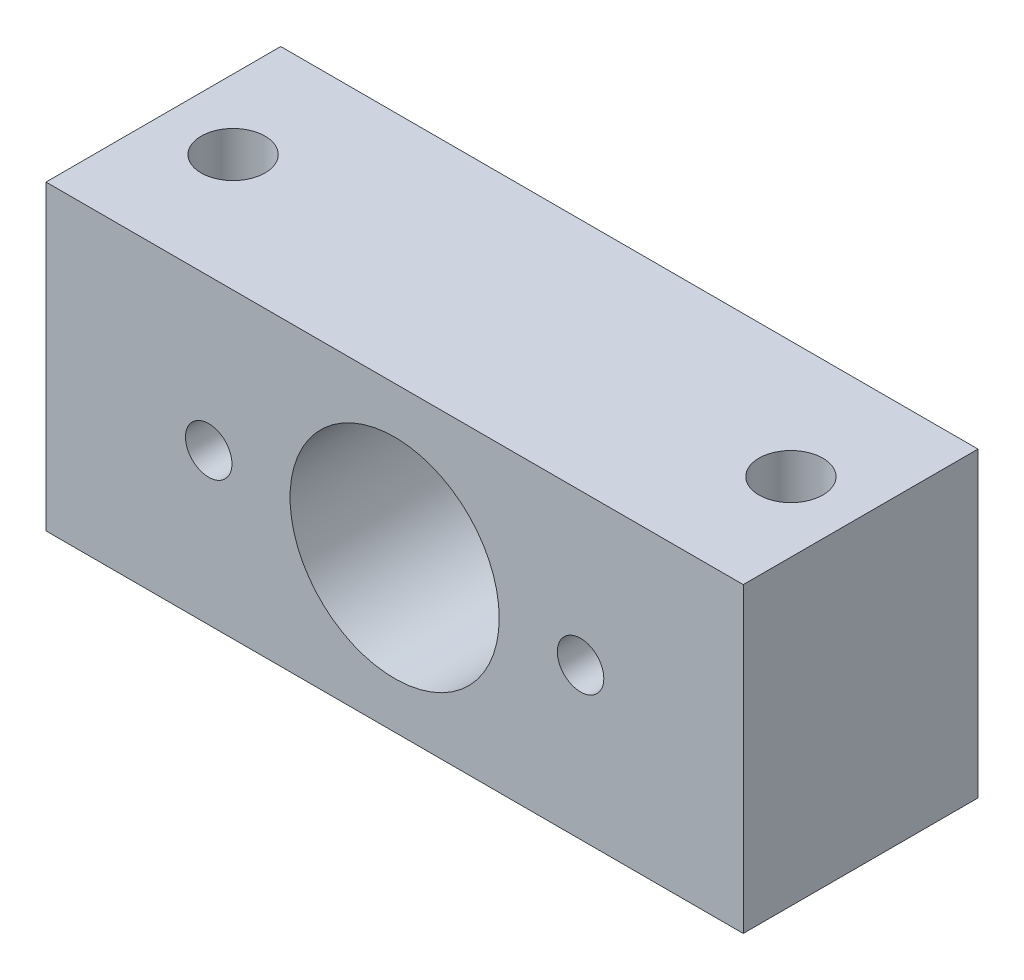
ISO-10303-21;
HEADER;
FILE_DESCRIPTION(('STEP AP214'),'2;1');
FILE_NAME('part.step','',(''),(''),'','','');
FILE_SCHEMA(('AUTOMOTIVE_DESIGN { 1 0 10303 214 1 1 1 1 }'));
ENDSEC;
DATA;
#1=APPLICATION_CONTEXT('core data for automotive mechanical design processes');
#2=APPLICATION_PROTOCOL_DEFINITION('international standard','automotive_design',2000,#1);
#3=PRODUCT_CONTEXT('',#1,'mechanical');
#4=PRODUCT('Part','Part','',(#3));
#5=PRODUCT_RELATED_PRODUCT_CATEGORY('part','',(#4));
#6=PRODUCT_DEFINITION_FORMATION('','',#4);
#7=PRODUCT_DEFINITION_CONTEXT('part definition',#1,'design');
#8=PRODUCT_DEFINITION('design','',#6,#7);
#9=PRODUCT_DEFINITION_SHAPE('','',#8);
#10=(LENGTH_UNIT() NAMED_UNIT(*) SI_UNIT(.MILLI.,.METRE.));
#11=(NAMED_UNIT(*) PLANE_ANGLE_UNIT() SI_UNIT($,.RADIAN.));
#12=(NAMED_UNIT(*) SI_UNIT($,.STERADIAN.) SOLID_ANGLE_UNIT());
#13=UNCERTAINTY_MEASURE_WITH_UNIT(LENGTH_MEASURE(1.E-05),#10,'distance_accuracy_value','');
#14=(GEOMETRIC_REPRESENTATION_CONTEXT(3) GLOBAL_UNCERTAINTY_ASSIGNED_CONTEXT((#13)) GLOBAL_UNIT_ASSIGNED_CONTEXT((#10,
#11,#12)) REPRESENTATION_CONTEXT('',''));
#15=CARTESIAN_POINT('',(0.,0.,0.));
#16=DIRECTION('',(0.,0.,1.));
#17=DIRECTION('',(1.,0.,0.));
#18=AXIS2_PLACEMENT_3D('',#15,#16,#17);
#19=CARTESIAN_POINT('',(30.,13.,0.));
#20=DIRECTION('',(0.,0.,1.));
#21=DIRECTION('',(1.,0.,0.));
#22=AXIS2_PLACEMENT_3D('',#19,#20,#21);
#23=CYLINDRICAL_SURFACE('',#22,9.00000000000001);
#24=CARTESIAN_POINT('',(30.,13.,20.2));
#25=DIRECTION('',(0.,0.,1.));
#26=DIRECTION('',(1.,0.,0.));
#27=AXIS2_PLACEMENT_3D('',#24,#25,#26);
#28=CIRCLE('',#27,9.00000000000001);
#29=CARTESIAN_POINT('',(39.,13.,20.2));
#30=VERTEX_POINT('',#29);
#31=EDGE_CURVE('E102',#30,#30,#28,.T.);
#32=ORIENTED_EDGE('',*,*,#31,.T.);
#33=EDGE_LOOP('',(#32));
#34=FACE_BOUND('',#33,.T.);
#35=CARTESIAN_POINT('',(30.,13.,4.));
#36=DIRECTION('',(0.,0.,-1.));
#37=DIRECTION('',(-1.,0.,0.));
#38=AXIS2_PLACEMENT_3D('',#35,#36,#37);
#39=CIRCLE('',#38,9.00000000000001);
#40=CARTESIAN_POINT('',(21.,13.,4.));
#41=VERTEX_POINT('',#40);
#42=EDGE_CURVE('E37',#41,#41,#39,.F.);
#43=ORIENTED_EDGE('',*,*,#42,.F.);
#44=EDGE_LOOP('',(#43));
#45=FACE_BOUND('',#44,.T.);
#46=ADVANCED_FACE('F33',(#34,#45),#23,.F.);
#47=CARTESIAN_POINT('',(0.,0.,20.2));
#48=DIRECTION('',(1.,0.,0.));
#49=DIRECTION('',(0.,1.,0.));
#50=AXIS2_PLACEMENT_3D('',#47,#48,#49);
#51=PLANE('',#50);
#52=DIRECTION('',(0.,-1.,0.));
#53=VECTOR('',#52,1.);
#54=CARTESIAN_POINT('',(0.,0.,0.));
#55=LINE('',#54,#53);
#56=CARTESIAN_POINT('',(0.,26.,0.));
#57=VERTEX_POINT('',#56);
#58=CARTESIAN_POINT('',(0.,0.,0.));
#59=VERTEX_POINT('',#58);
#60=EDGE_CURVE('E99',#57,#59,#55,.T.);
#61=ORIENTED_EDGE('',*,*,#60,.T.);
#62=DIRECTION('',(0.,0.,-1.));
#63=VECTOR('',#62,1.);
#64=CARTESIAN_POINT('',(0.,0.,20.2));
#65=LINE('',#64,#63);
#66=CARTESIAN_POINT('',(0.,0.,20.2));
#67=VERTEX_POINT('',#66);
#68=EDGE_CURVE('E11',#67,#59,#65,.T.);
#69=ORIENTED_EDGE('',*,*,#68,.F.);
#70=DIRECTION('',(0.,-1.,0.));
#71=VECTOR('',#70,1.);
#72=CARTESIAN_POINT('',(0.,0.,20.2));
#73=LINE('',#72,#71);
#74=CARTESIAN_POINT('',(0.,26.,20.2));
#75=VERTEX_POINT('',#74);
#76=EDGE_CURVE('E86',#75,#67,#73,.T.);
#77=ORIENTED_EDGE('',*,*,#76,.F.);
#78=DIRECTION('',(0.,0.,-1.));
#79=VECTOR('',#78,1.);
#80=CARTESIAN_POINT('',(0.,26.,20.2));
#81=LINE('',#80,#79);
#82=EDGE_CURVE('E95',#75,#57,#81,.T.);
#83=ORIENTED_EDGE('',*,*,#82,.T.);
#84=EDGE_LOOP('',(#61,#69,#77,#83));
#85=FACE_BOUND('',#84,.T.);
#86=ADVANCED_FACE('F35',(#85),#51,.F.);
#87=CARTESIAN_POINT('',(0.,0.,20.2));
#88=DIRECTION('',(0.,1.,0.));
#89=DIRECTION('',(-1.,0.,0.));
#90=AXIS2_PLACEMENT_3D('',#87,#88,#89);
#91=PLANE('',#90);
#92=CARTESIAN_POINT('',(6.,0.,10.1));
#93=DIRECTION('',(0.,1.,0.));
#94=DIRECTION('',(-1.,0.,0.));
#95=AXIS2_PLACEMENT_3D('',#92,#93,#94);
#96=CIRCLE('',#95,2.74999999999999);
#97=CARTESIAN_POINT('',(3.25,0.,10.1));
#98=VERTEX_POINT('',#97);
#99=EDGE_CURVE('E139',#98,#98,#96,.T.);
#100=ORIENTED_EDGE('',*,*,#99,.T.);
#101=EDGE_LOOP('',(#100));
#102=FACE_BOUND('',#101,.T.);
#103=CARTESIAN_POINT('',(54.,0.,10.1));
#104=DIRECTION('',(0.,1.,0.));
#105=DIRECTION('',(-1.,0.,0.));
#106=AXIS2_PLACEMENT_3D('',#103,#104,#105);
#107=CIRCLE('',#106,2.75);
#108=CARTESIAN_POINT('',(51.25,0.,10.1));
#109=VERTEX_POINT('',#108);
#110=EDGE_CURVE('E131',#109,#109,#107,.T.);
#111=ORIENTED_EDGE('',*,*,#110,.T.);
#112=EDGE_LOOP('',(#111));
#113=FACE_BOUND('',#112,.T.);
#114=DIRECTION('',(1.,0.,0.));
#115=VECTOR('',#114,1.);
#116=CARTESIAN_POINT('',(0.,0.,0.));
#117=LINE('',#116,#115);
#118=CARTESIAN_POINT('',(60.,0.,0.));
#119=VERTEX_POINT('',#118);
#120=EDGE_CURVE('E90',#59,#119,#117,.T.);
#121=ORIENTED_EDGE('',*,*,#120,.T.);
#122=DIRECTION('',(0.,0.,-1.));
#123=VECTOR('',#122,1.);
#124=CARTESIAN_POINT('',(60.,0.,20.2));
#125=LINE('',#124,#123);
#126=CARTESIAN_POINT('',(60.,0.,20.2));
#127=VERTEX_POINT('',#126);
#128=EDGE_CURVE('E43',#127,#119,#125,.T.);
#129=ORIENTED_EDGE('',*,*,#128,.F.);
#130=DIRECTION('',(1.,0.,0.));
#131=VECTOR('',#130,1.);
#132=CARTESIAN_POINT('',(0.,0.,20.2));
#133=LINE('',#132,#131);
#134=EDGE_CURVE('E81',#67,#127,#133,.T.);
#135=ORIENTED_EDGE('',*,*,#134,.F.);
#136=ORIENTED_EDGE('',*,*,#68,.T.);
#137=EDGE_LOOP('',(#121,#129,#135,#136));
#138=FACE_BOUND('',#137,.T.);
#139=ADVANCED_FACE('F89',(#102,#113,#138),#91,.F.);
#140=CARTESIAN_POINT('',(60.,0.,20.2));
#141=DIRECTION('',(-1.,0.,0.));
#142=DIRECTION('',(0.,0.,1.));
#143=AXIS2_PLACEMENT_3D('',#140,#141,#142);
#144=PLANE('',#143);
#145=DIRECTION('',(0.,1.,0.));
#146=VECTOR('',#145,1.);
#147=CARTESIAN_POINT('',(60.,0.,0.));
#148=LINE('',#147,#146);
#149=CARTESIAN_POINT('',(60.,26.,0.));
#150=VERTEX_POINT('',#149);
#151=EDGE_CURVE('E68',#119,#150,#148,.T.);
#152=ORIENTED_EDGE('',*,*,#151,.T.);
#153=DIRECTION('',(0.,0.,-1.));
#154=VECTOR('',#153,1.);
#155=CARTESIAN_POINT('',(60.,26.,20.2));
#156=LINE('',#155,#154);
#157=CARTESIAN_POINT('',(60.,26.,20.2));
#158=VERTEX_POINT('',#157);
#159=EDGE_CURVE('E91',#158,#150,#156,.T.);
#160=ORIENTED_EDGE('',*,*,#159,.F.);
#161=DIRECTION('',(0.,1.,0.));
#162=VECTOR('',#161,1.);
#163=CARTESIAN_POINT('',(60.,0.,20.2));
#164=LINE('',#163,#162);
#165=EDGE_CURVE('E84',#127,#158,#164,.T.);
#166=ORIENTED_EDGE('',*,*,#165,.F.);
#167=ORIENTED_EDGE('',*,*,#128,.T.);
#168=EDGE_LOOP('',(#152,#160,#166,#167));
#169=FACE_BOUND('',#168,.T.);
#170=ADVANCED_FACE('F93',(#169),#144,.F.);
#171=CARTESIAN_POINT('',(0.,26.,20.2));
#172=DIRECTION('',(0.,-1.,0.));
#173=DIRECTION('',(0.,0.,-1.));
#174=AXIS2_PLACEMENT_3D('',#171,#172,#173);
#175=PLANE('',#174);
#176=CARTESIAN_POINT('',(6.,26.,10.1));
#177=DIRECTION('',(0.,1.,0.));
#178=DIRECTION('',(0.,0.,1.));
#179=AXIS2_PLACEMENT_3D('',#176,#177,#178);
#180=CIRCLE('',#179,2.75);
#181=CARTESIAN_POINT('',(6.,26.,12.85));
#182=VERTEX_POINT('',#181);
#183=EDGE_CURVE('E142',#182,#182,#180,.T.);
#184=ORIENTED_EDGE('',*,*,#183,.F.);
#185=EDGE_LOOP('',(#184));
#186=FACE_BOUND('',#185,.T.);
#187=CARTESIAN_POINT('',(54.,26.,10.1));
#188=DIRECTION('',(0.,1.,0.));
#189=DIRECTION('',(0.,0.,1.));
#190=AXIS2_PLACEMENT_3D('',#187,#188,#189);
#191=CIRCLE('',#190,2.75);
#192=CARTESIAN_POINT('',(54.,26.,12.85));
#193=VERTEX_POINT('',#192);
#194=EDGE_CURVE('E136',#193,#193,#191,.T.);
#195=ORIENTED_EDGE('',*,*,#194,.F.);
#196=EDGE_LOOP('',(#195));
#197=FACE_BOUND('',#196,.T.);
#198=DIRECTION('',(-1.,0.,0.));
#199=VECTOR('',#198,1.);
#200=CARTESIAN_POINT('',(0.,26.,0.));
#201=LINE('',#200,#199);
#202=EDGE_CURVE('E74',#150,#57,#201,.T.);
#203=ORIENTED_EDGE('',*,*,#202,.T.);
#204=ORIENTED_EDGE('',*,*,#82,.F.);
#205=DIRECTION('',(-1.,0.,0.));
#206=VECTOR('',#205,1.);
#207=CARTESIAN_POINT('',(0.,26.,20.2));
#208=LINE('',#207,#206);
#209=EDGE_CURVE('E51',#158,#75,#208,.T.);
#210=ORIENTED_EDGE('',*,*,#209,.F.);
#211=ORIENTED_EDGE('',*,*,#159,.T.);
#212=EDGE_LOOP('',(#203,#204,#210,#211));
#213=FACE_BOUND('',#212,.T.);
#214=ADVANCED_FACE('F107',(#186,#197,#213),#175,.F.);
#215=CARTESIAN_POINT('',(0.,26.,20.2));
#216=DIRECTION('',(0.,0.,-1.));
#217=DIRECTION('',(-1.,0.,0.));
#218=AXIS2_PLACEMENT_3D('',#215,#216,#217);
#219=PLANE('',#218);
#220=CARTESIAN_POINT('',(46.,13.,20.2));
#221=DIRECTION('',(0.,0.,1.));
#222=DIRECTION('',(1.,0.,0.));
#223=AXIS2_PLACEMENT_3D('',#220,#221,#222);
#224=CIRCLE('',#223,2.);
#225=CARTESIAN_POINT('',(48.,13.,20.2));
#226=VERTEX_POINT('',#225);
#227=EDGE_CURVE('E122',#226,#226,#224,.T.);
#228=ORIENTED_EDGE('',*,*,#227,.F.);
#229=EDGE_LOOP('',(#228));
#230=FACE_BOUND('',#229,.T.);
#231=CARTESIAN_POINT('',(14.,13.,20.2));
#232=DIRECTION('',(0.,0.,1.));
#233=DIRECTION('',(1.,0.,0.));
#234=AXIS2_PLACEMENT_3D('',#231,#232,#233);
#235=CIRCLE('',#234,2.);
#236=CARTESIAN_POINT('',(16.,13.,20.2));
#237=VERTEX_POINT('',#236);
#238=EDGE_CURVE('E116',#237,#237,#235,.T.);
#239=ORIENTED_EDGE('',*,*,#238,.F.);
#240=EDGE_LOOP('',(#239));
#241=FACE_BOUND('',#240,.T.);
#242=ORIENTED_EDGE('',*,*,#31,.F.);
#243=EDGE_LOOP('',(#242));
#244=FACE_BOUND('',#243,.T.);
#245=ORIENTED_EDGE('',*,*,#76,.T.);
#246=ORIENTED_EDGE('',*,*,#134,.T.);
#247=ORIENTED_EDGE('',*,*,#165,.T.);
#248=ORIENTED_EDGE('',*,*,#209,.T.);
#249=EDGE_LOOP('',(#245,#246,#247,#248));
#250=FACE_BOUND('',#249,.T.);
#251=ADVANCED_FACE('F82',(#230,#241,#244,#250),#219,.F.);
#252=CARTESIAN_POINT('',(0.,26.,0.));
#253=DIRECTION('',(0.,0.,-1.));
#254=DIRECTION('',(-1.,0.,0.));
#255=AXIS2_PLACEMENT_3D('',#252,#253,#254);
#256=PLANE('',#255);
#257=CARTESIAN_POINT('',(30.,13.,0.));
#258=DIRECTION('',(0.,0.,-1.));
#259=DIRECTION('',(-1.,0.,0.));
#260=AXIS2_PLACEMENT_3D('',#257,#258,#259);
#261=CIRCLE('',#260,11.5);
#262=CARTESIAN_POINT('',(18.5,13.,0.));
#263=VERTEX_POINT('',#262);
#264=EDGE_CURVE('E127',#263,#263,#261,.T.);
#265=ORIENTED_EDGE('',*,*,#264,.F.);
#266=EDGE_LOOP('',(#265));
#267=FACE_BOUND('',#266,.T.);
#268=CARTESIAN_POINT('',(46.,13.,0.));
#269=DIRECTION('',(0.,0.,1.));
#270=DIRECTION('',(1.,0.,0.));
#271=AXIS2_PLACEMENT_3D('',#268,#269,#270);
#272=CIRCLE('',#271,2.);
#273=CARTESIAN_POINT('',(48.,13.,0.));
#274=VERTEX_POINT('',#273);
#275=EDGE_CURVE('E119',#274,#274,#272,.T.);
#276=ORIENTED_EDGE('',*,*,#275,.T.);
#277=EDGE_LOOP('',(#276));
#278=FACE_BOUND('',#277,.T.);
#279=CARTESIAN_POINT('',(14.,13.,0.));
#280=DIRECTION('',(0.,0.,1.));
#281=DIRECTION('',(1.,0.,0.));
#282=AXIS2_PLACEMENT_3D('',#279,#280,#281);
#283=CIRCLE('',#282,2.);
#284=CARTESIAN_POINT('',(16.,13.,0.));
#285=VERTEX_POINT('',#284);
#286=EDGE_CURVE('E115',#285,#285,#283,.T.);
#287=ORIENTED_EDGE('',*,*,#286,.T.);
#288=EDGE_LOOP('',(#287));
#289=FACE_BOUND('',#288,.T.);
#290=ORIENTED_EDGE('',*,*,#60,.F.);
#291=ORIENTED_EDGE('',*,*,#202,.F.);
#292=ORIENTED_EDGE('',*,*,#151,.F.);
#293=ORIENTED_EDGE('',*,*,#120,.F.);
#294=EDGE_LOOP('',(#290,#291,#292,#293));
#295=FACE_BOUND('',#294,.T.);
#296=ADVANCED_FACE('F110',(#267,#278,#289,#295),#256,.T.);
#297=CARTESIAN_POINT('',(14.,13.,0.));
#298=DIRECTION('',(0.,0.,1.));
#299=DIRECTION('',(1.,0.,0.));
#300=AXIS2_PLACEMENT_3D('',#297,#298,#299);
#301=CYLINDRICAL_SURFACE('',#300,2.);
#302=ORIENTED_EDGE('',*,*,#286,.F.);
#303=EDGE_LOOP('',(#302));
#304=FACE_BOUND('',#303,.T.);
#305=ORIENTED_EDGE('',*,*,#238,.T.);
#306=EDGE_LOOP('',(#305));
#307=FACE_BOUND('',#306,.T.);
#308=ADVANCED_FACE('F176',(#304,#307),#301,.F.);
#309=CARTESIAN_POINT('',(46.,13.,0.));
#310=DIRECTION('',(0.,0.,1.));
#311=DIRECTION('',(1.,0.,0.));
#312=AXIS2_PLACEMENT_3D('',#309,#310,#311);
#313=CYLINDRICAL_SURFACE('',#312,2.);
#314=ORIENTED_EDGE('',*,*,#275,.F.);
#315=EDGE_LOOP('',(#314));
#316=FACE_BOUND('',#315,.T.);
#317=ORIENTED_EDGE('',*,*,#227,.T.);
#318=EDGE_LOOP('',(#317));
#319=FACE_BOUND('',#318,.T.);
#320=ADVANCED_FACE('F186',(#316,#319),#313,.F.);
#321=CARTESIAN_POINT('',(30.,13.,4.));
#322=DIRECTION('',(0.,0.,-1.));
#323=DIRECTION('',(-1.,0.,0.));
#324=AXIS2_PLACEMENT_3D('',#321,#322,#323);
#325=PLANE('',#324);
#326=CARTESIAN_POINT('',(30.,13.,4.));
#327=DIRECTION('',(0.,0.,-1.));
#328=DIRECTION('',(-1.,0.,0.));
#329=AXIS2_PLACEMENT_3D('',#326,#327,#328);
#330=CIRCLE('',#329,11.5);
#331=CARTESIAN_POINT('',(18.5,13.,4.));
#332=VERTEX_POINT('',#331);
#333=EDGE_CURVE('E130',#332,#332,#330,.T.);
#334=ORIENTED_EDGE('',*,*,#333,.T.);
#335=EDGE_LOOP('',(#334));
#336=FACE_BOUND('',#335,.T.);
#337=ORIENTED_EDGE('',*,*,#42,.T.);
#338=EDGE_LOOP('',(#337));
#339=FACE_BOUND('',#338,.T.);
#340=ADVANCED_FACE('F201',(#336,#339),#325,.T.);
#341=CARTESIAN_POINT('',(30.,13.,4.));
#342=DIRECTION('',(0.,0.,-1.));
#343=DIRECTION('',(-1.,0.,0.));
#344=AXIS2_PLACEMENT_3D('',#341,#342,#343);
#345=CYLINDRICAL_SURFACE('',#344,11.5);
#346=ORIENTED_EDGE('',*,*,#333,.F.);
#347=EDGE_LOOP('',(#346));
#348=FACE_BOUND('',#347,.T.);
#349=ORIENTED_EDGE('',*,*,#264,.T.);
#350=EDGE_LOOP('',(#349));
#351=FACE_BOUND('',#350,.T.);
#352=ADVANCED_FACE('F157',(#348,#351),#345,.F.);
#353=CARTESIAN_POINT('',(54.,26.,10.1));
#354=DIRECTION('',(0.,1.,0.));
#355=DIRECTION('',(0.,0.,1.));
#356=AXIS2_PLACEMENT_3D('',#353,#354,#355);
#357=CYLINDRICAL_SURFACE('',#356,2.75);
#358=ORIENTED_EDGE('',*,*,#194,.T.);
#359=EDGE_LOOP('',(#358));
#360=FACE_BOUND('',#359,.T.);
#361=ORIENTED_EDGE('',*,*,#110,.F.);
#362=EDGE_LOOP('',(#361));
#363=FACE_BOUND('',#362,.T.);
#364=ADVANCED_FACE('F154',(#360,#363),#357,.F.);
#365=CARTESIAN_POINT('',(6.,26.,10.1));
#366=DIRECTION('',(0.,1.,0.));
#367=DIRECTION('',(0.,0.,1.));
#368=AXIS2_PLACEMENT_3D('',#365,#366,#367);
#369=CYLINDRICAL_SURFACE('',#368,2.74999999999999);
#370=ORIENTED_EDGE('',*,*,#183,.T.);
#371=EDGE_LOOP('',(#370));
#372=FACE_BOUND('',#371,.T.);
#373=ORIENTED_EDGE('',*,*,#99,.F.);
#374=EDGE_LOOP('',(#373));
#375=FACE_BOUND('',#374,.T.);
#376=ADVANCED_FACE('F146',(#372,#375),#369,.F.);
#377=CLOSED_SHELL('',(#46,#86,#139,#170,#214,#251,#296,#308,#320,#340,#352,#364,#376));
#378=MANIFOLD_SOLID_BREP('B2',#377);
#379=ADVANCED_BREP_SHAPE_REPRESENTATION('',(#18,#378),#14);
#380=SHAPE_DEFINITION_REPRESENTATION(#9,#379);
ENDSEC;
END-ISO-10303-21;
